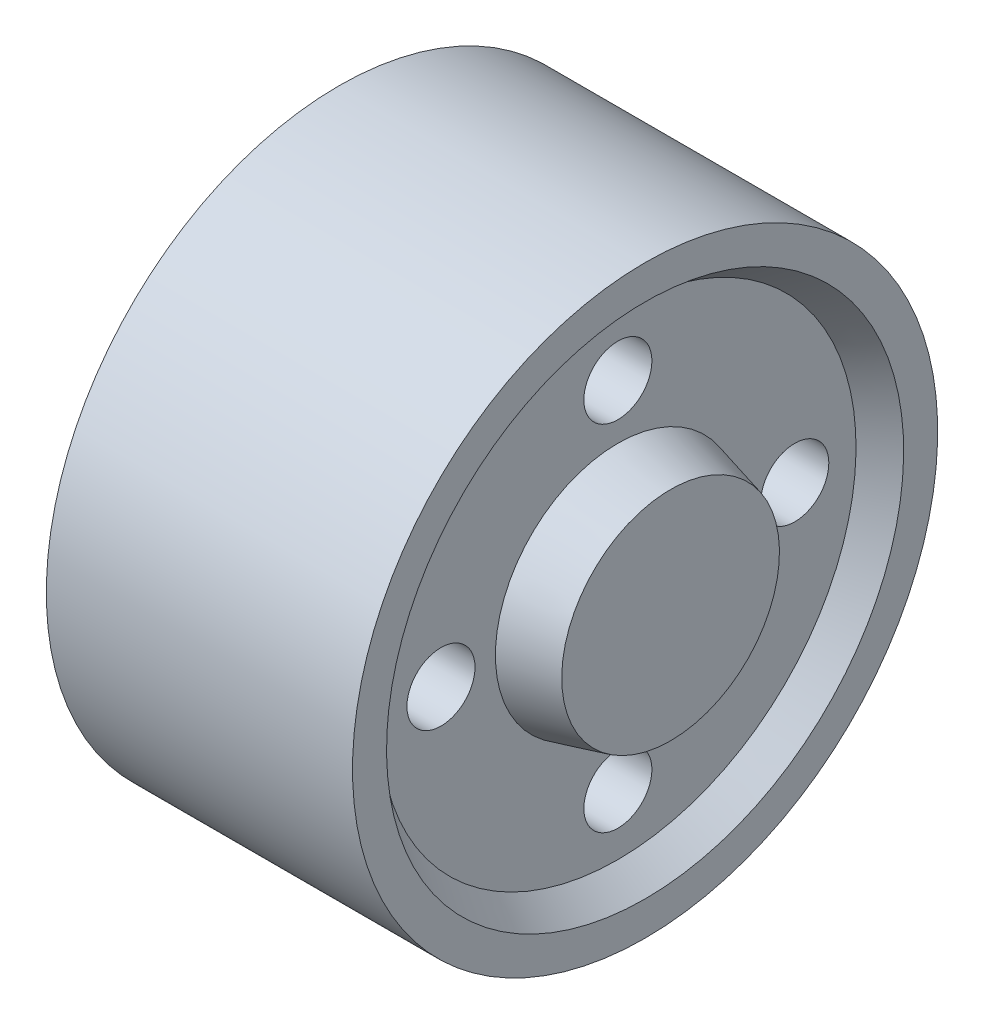
ISO-10303-21;
HEADER;
FILE_DESCRIPTION(('STEP AP214'),'2;1');
FILE_NAME('part.step','',(''),(''),'','','');
FILE_SCHEMA(('AUTOMOTIVE_DESIGN { 1 0 10303 214 1 1 1 1 }'));
ENDSEC;
DATA;
#1=APPLICATION_CONTEXT('core data for automotive mechanical design processes');
#2=APPLICATION_PROTOCOL_DEFINITION('international standard','automotive_design',2000,#1);
#3=PRODUCT_CONTEXT('',#1,'mechanical');
#4=PRODUCT('Part','Part','',(#3));
#5=PRODUCT_RELATED_PRODUCT_CATEGORY('part','',(#4));
#6=PRODUCT_DEFINITION_FORMATION('','',#4);
#7=PRODUCT_DEFINITION_CONTEXT('part definition',#1,'design');
#8=PRODUCT_DEFINITION('design','',#6,#7);
#9=PRODUCT_DEFINITION_SHAPE('','',#8);
#10=(LENGTH_UNIT() NAMED_UNIT(*) SI_UNIT(.MILLI.,.METRE.));
#11=(NAMED_UNIT(*) PLANE_ANGLE_UNIT() SI_UNIT($,.RADIAN.));
#12=(NAMED_UNIT(*) SI_UNIT($,.STERADIAN.) SOLID_ANGLE_UNIT());
#13=UNCERTAINTY_MEASURE_WITH_UNIT(LENGTH_MEASURE(1.E-05),#10,'distance_accuracy_value','');
#14=(GEOMETRIC_REPRESENTATION_CONTEXT(3) GLOBAL_UNCERTAINTY_ASSIGNED_CONTEXT((#13)) GLOBAL_UNIT_ASSIGNED_CONTEXT((#10,
#11,#12)) REPRESENTATION_CONTEXT('',''));
#15=CARTESIAN_POINT('',(0.,0.,0.));
#16=DIRECTION('',(0.,0.,1.));
#17=DIRECTION('',(1.,0.,0.));
#18=AXIS2_PLACEMENT_3D('',#15,#16,#17);
#19=CARTESIAN_POINT('',(52.4919333848297,0.,0.));
#20=DIRECTION('',(-1.,0.,0.));
#21=DIRECTION('',(0.,-1.,0.));
#22=AXIS2_PLACEMENT_3D('',#19,#20,#21);
#23=PLANE('',#22);
#24=CARTESIAN_POINT('',(52.4919333848297,0.,0.));
#25=DIRECTION('',(-1.,0.,0.));
#26=DIRECTION('',(0.,-1.,0.));
#27=AXIS2_PLACEMENT_3D('',#24,#25,#26);
#28=CIRCLE('',#27,16.);
#29=CARTESIAN_POINT('',(52.4919333848297,-16.,0.));
#30=VERTEX_POINT('',#29);
#31=EDGE_CURVE('E10',#30,#30,#28,.T.);
#32=ORIENTED_EDGE('',*,*,#31,.F.);
#33=EDGE_LOOP('',(#32));
#34=FACE_BOUND('',#33,.T.);
#35=ADVANCED_FACE('F37',(#34),#23,.F.);
#36=CARTESIAN_POINT('',(52.4919333848297,0.,0.));
#37=DIRECTION('',(-1.,0.,0.));
#38=DIRECTION('',(0.,-1.,0.));
#39=AXIS2_PLACEMENT_3D('',#36,#37,#38);
#40=CONICAL_SURFACE('',#39,16.,0.252680255142077);
#41=CARTESIAN_POINT('',(44.7459666924148,0.,0.));
#42=DIRECTION('',(-1.,0.,0.));
#43=DIRECTION('',(0.,-1.,0.));
#44=AXIS2_PLACEMENT_3D('',#41,#42,#43);
#45=CIRCLE('',#44,18.);
#46=CARTESIAN_POINT('',(44.7459666924148,-18.,0.));
#47=VERTEX_POINT('',#46);
#48=EDGE_CURVE('E44',#47,#47,#45,.T.);
#49=ORIENTED_EDGE('',*,*,#48,.F.);
#50=EDGE_LOOP('',(#49));
#51=FACE_BOUND('',#50,.T.);
#52=ORIENTED_EDGE('',*,*,#31,.T.);
#53=EDGE_LOOP('',(#52));
#54=FACE_BOUND('',#53,.T.);
#55=ADVANCED_FACE('F104',(#51,#54),#40,.T.);
#56=CARTESIAN_POINT('',(44.7459666924148,18.,0.));
#57=DIRECTION('',(-1.,0.,0.));
#58=DIRECTION('',(0.,-1.,0.));
#59=AXIS2_PLACEMENT_3D('',#56,#57,#58);
#60=PLANE('',#59);
#61=CARTESIAN_POINT('',(44.7459666924148,26.,0.));
#62=DIRECTION('',(-1.,0.,0.));
#63=DIRECTION('',(0.,-1.,0.));
#64=AXIS2_PLACEMENT_3D('',#61,#62,#63);
#65=CIRCLE('',#64,5.);
#66=CARTESIAN_POINT('',(44.7459666924148,21.,0.));
#67=VERTEX_POINT('',#66);
#68=EDGE_CURVE('E73',#67,#67,#65,.T.);
#69=ORIENTED_EDGE('',*,*,#68,.T.);
#70=EDGE_LOOP('',(#69));
#71=FACE_BOUND('',#70,.T.);
#72=CARTESIAN_POINT('',(44.7459666924148,0.,-26.));
#73=DIRECTION('',(-1.,0.,0.));
#74=DIRECTION('',(0.,-1.,0.));
#75=AXIS2_PLACEMENT_3D('',#72,#73,#74);
#76=CIRCLE('',#75,5.);
#77=CARTESIAN_POINT('',(44.7459666924148,-5.00000000000009,-26.));
#78=VERTEX_POINT('',#77);
#79=EDGE_CURVE('E62',#78,#78,#76,.T.);
#80=ORIENTED_EDGE('',*,*,#79,.T.);
#81=EDGE_LOOP('',(#80));
#82=FACE_BOUND('',#81,.T.);
#83=CARTESIAN_POINT('',(44.7459666924148,-26.,1.81557029619843E-13));
#84=DIRECTION('',(-1.,0.,0.));
#85=DIRECTION('',(0.,-1.,0.));
#86=AXIS2_PLACEMENT_3D('',#83,#84,#85);
#87=CIRCLE('',#86,5.);
#88=CARTESIAN_POINT('',(44.7459666924148,-31.,1.81557029619843E-13));
#89=VERTEX_POINT('',#88);
#90=EDGE_CURVE('E59',#89,#89,#87,.T.);
#91=ORIENTED_EDGE('',*,*,#90,.T.);
#92=EDGE_LOOP('',(#91));
#93=FACE_BOUND('',#92,.T.);
#94=CARTESIAN_POINT('',(44.7459666924148,2.77815344918226E-13,26.));
#95=DIRECTION('',(-1.,0.,0.));
#96=DIRECTION('',(0.,-1.,0.));
#97=AXIS2_PLACEMENT_3D('',#94,#95,#96);
#98=CIRCLE('',#97,5.);
#99=CARTESIAN_POINT('',(44.7459666924148,-4.99999999999972,26.));
#100=VERTEX_POINT('',#99);
#101=EDGE_CURVE('E56',#100,#100,#98,.T.);
#102=ORIENTED_EDGE('',*,*,#101,.T.);
#103=EDGE_LOOP('',(#102));
#104=FACE_BOUND('',#103,.T.);
#105=CARTESIAN_POINT('',(44.7459666924148,0.,0.));
#106=DIRECTION('',(-1.,0.,0.));
#107=DIRECTION('',(0.,-1.,0.));
#108=AXIS2_PLACEMENT_3D('',#105,#106,#107);
#109=CIRCLE('',#108,35.);
#110=CARTESIAN_POINT('',(44.7459666924148,-35.,0.));
#111=VERTEX_POINT('',#110);
#112=EDGE_CURVE('E49',#111,#111,#109,.T.);
#113=ORIENTED_EDGE('',*,*,#112,.F.);
#114=EDGE_LOOP('',(#113));
#115=FACE_BOUND('',#114,.T.);
#116=ORIENTED_EDGE('',*,*,#48,.T.);
#117=EDGE_LOOP('',(#116));
#118=FACE_BOUND('',#117,.T.);
#119=ADVANCED_FACE('F101',(#71,#82,#93,#104,#115,#118),#60,.F.);
#120=CARTESIAN_POINT('',(44.7459666924148,0.,0.));
#121=DIRECTION('',(1.,0.,0.));
#122=DIRECTION('',(0.,1.,0.));
#123=AXIS2_PLACEMENT_3D('',#120,#121,#122);
#124=CONICAL_SURFACE('',#123,35.,0.643501108793285);
#125=CARTESIAN_POINT('',(48.7459666924148,0.,0.));
#126=DIRECTION('',(-1.,0.,0.));
#127=DIRECTION('',(0.,-1.,0.));
#128=AXIS2_PLACEMENT_3D('',#125,#126,#127);
#129=CIRCLE('',#128,38.);
#130=CARTESIAN_POINT('',(48.7459666924148,-38.,0.));
#131=VERTEX_POINT('',#130);
#132=EDGE_CURVE('E94',#131,#131,#129,.T.);
#133=ORIENTED_EDGE('',*,*,#132,.F.);
#134=EDGE_LOOP('',(#133));
#135=FACE_BOUND('',#134,.T.);
#136=ORIENTED_EDGE('',*,*,#112,.T.);
#137=EDGE_LOOP('',(#136));
#138=FACE_BOUND('',#137,.T.);
#139=ADVANCED_FACE('F99',(#135,#138),#124,.F.);
#140=CARTESIAN_POINT('',(48.7459666924148,38.,0.));
#141=DIRECTION('',(-1.,0.,0.));
#142=DIRECTION('',(0.,-1.,0.));
#143=AXIS2_PLACEMENT_3D('',#140,#141,#142);
#144=PLANE('',#143);
#145=CARTESIAN_POINT('',(48.7459666924148,0.,0.));
#146=DIRECTION('',(-1.,0.,0.));
#147=DIRECTION('',(0.,-1.,0.));
#148=AXIS2_PLACEMENT_3D('',#145,#146,#147);
#149=CIRCLE('',#148,43.);
#150=CARTESIAN_POINT('',(48.7459666924148,-43.,0.));
#151=VERTEX_POINT('',#150);
#152=EDGE_CURVE('E91',#151,#151,#149,.T.);
#153=ORIENTED_EDGE('',*,*,#152,.F.);
#154=EDGE_LOOP('',(#153));
#155=FACE_BOUND('',#154,.T.);
#156=ORIENTED_EDGE('',*,*,#132,.T.);
#157=EDGE_LOOP('',(#156));
#158=FACE_BOUND('',#157,.T.);
#159=ADVANCED_FACE('F117',(#155,#158),#144,.F.);
#160=CARTESIAN_POINT('',(0.,0.,0.));
#161=DIRECTION('',(-1.,0.,0.));
#162=DIRECTION('',(0.,-1.,0.));
#163=AXIS2_PLACEMENT_3D('',#160,#161,#162);
#164=CYLINDRICAL_SURFACE('',#163,43.);
#165=CARTESIAN_POINT('',(3.74596669241484,0.,0.));
#166=DIRECTION('',(-1.,0.,0.));
#167=DIRECTION('',(0.,-1.,0.));
#168=AXIS2_PLACEMENT_3D('',#165,#166,#167);
#169=CIRCLE('',#168,43.);
#170=CARTESIAN_POINT('',(3.74596669241484,-43.,0.));
#171=VERTEX_POINT('',#170);
#172=EDGE_CURVE('E88',#171,#171,#169,.T.);
#173=ORIENTED_EDGE('',*,*,#172,.F.);
#174=EDGE_LOOP('',(#173));
#175=FACE_BOUND('',#174,.T.);
#176=ORIENTED_EDGE('',*,*,#152,.T.);
#177=EDGE_LOOP('',(#176));
#178=FACE_BOUND('',#177,.T.);
#179=ADVANCED_FACE('F121',(#175,#178),#164,.T.);
#180=CARTESIAN_POINT('',(3.74596669241483,38.,0.));
#181=DIRECTION('',(1.,0.,0.));
#182=DIRECTION('',(0.,1.,0.));
#183=AXIS2_PLACEMENT_3D('',#180,#181,#182);
#184=PLANE('',#183);
#185=CARTESIAN_POINT('',(3.74596669241484,0.,0.));
#186=DIRECTION('',(-1.,0.,0.));
#187=DIRECTION('',(0.,-1.,0.));
#188=AXIS2_PLACEMENT_3D('',#185,#186,#187);
#189=CIRCLE('',#188,38.);
#190=CARTESIAN_POINT('',(3.74596669241484,-38.,0.));
#191=VERTEX_POINT('',#190);
#192=EDGE_CURVE('E85',#191,#191,#189,.T.);
#193=ORIENTED_EDGE('',*,*,#192,.F.);
#194=EDGE_LOOP('',(#193));
#195=FACE_BOUND('',#194,.T.);
#196=ORIENTED_EDGE('',*,*,#172,.T.);
#197=EDGE_LOOP('',(#196));
#198=FACE_BOUND('',#197,.T.);
#199=ADVANCED_FACE('F125',(#195,#198),#184,.F.);
#200=CARTESIAN_POINT('',(3.74596669241484,0.,0.));
#201=DIRECTION('',(-1.,0.,0.));
#202=DIRECTION('',(0.,-1.,0.));
#203=AXIS2_PLACEMENT_3D('',#200,#201,#202);
#204=CONICAL_SURFACE('',#203,38.,0.643501108793283);
#205=CARTESIAN_POINT('',(7.74596669241484,0.,0.));
#206=DIRECTION('',(-1.,0.,0.));
#207=DIRECTION('',(0.,-1.,0.));
#208=AXIS2_PLACEMENT_3D('',#205,#206,#207);
#209=CIRCLE('',#208,35.);
#210=CARTESIAN_POINT('',(7.74596669241484,-35.,0.));
#211=VERTEX_POINT('',#210);
#212=EDGE_CURVE('E82',#211,#211,#209,.T.);
#213=ORIENTED_EDGE('',*,*,#212,.F.);
#214=EDGE_LOOP('',(#213));
#215=FACE_BOUND('',#214,.T.);
#216=ORIENTED_EDGE('',*,*,#192,.T.);
#217=EDGE_LOOP('',(#216));
#218=FACE_BOUND('',#217,.T.);
#219=ADVANCED_FACE('F129',(#215,#218),#204,.F.);
#220=CARTESIAN_POINT('',(7.74596669241484,18.,0.));
#221=DIRECTION('',(1.,0.,0.));
#222=DIRECTION('',(0.,1.,0.));
#223=AXIS2_PLACEMENT_3D('',#220,#221,#222);
#224=PLANE('',#223);
#225=CARTESIAN_POINT('',(7.74596669241483,26.,0.));
#226=DIRECTION('',(1.,0.,0.));
#227=DIRECTION('',(0.,1.,0.));
#228=AXIS2_PLACEMENT_3D('',#225,#226,#227);
#229=CIRCLE('',#228,5.);
#230=CARTESIAN_POINT('',(7.74596669241483,31.,0.));
#231=VERTEX_POINT('',#230);
#232=EDGE_CURVE('E40',#231,#231,#229,.T.);
#233=ORIENTED_EDGE('',*,*,#232,.T.);
#234=EDGE_LOOP('',(#233));
#235=FACE_BOUND('',#234,.T.);
#236=CARTESIAN_POINT('',(7.74596669241484,0.,-26.));
#237=DIRECTION('',(1.,0.,0.));
#238=DIRECTION('',(0.,1.,0.));
#239=AXIS2_PLACEMENT_3D('',#236,#237,#238);
#240=CIRCLE('',#239,5.);
#241=CARTESIAN_POINT('',(7.74596669241484,4.99999999999991,-26.));
#242=VERTEX_POINT('',#241);
#243=EDGE_CURVE('E60',#242,#242,#240,.T.);
#244=ORIENTED_EDGE('',*,*,#243,.T.);
#245=EDGE_LOOP('',(#244));
#246=FACE_BOUND('',#245,.T.);
#247=CARTESIAN_POINT('',(7.74596669241484,-26.,1.81557029619843E-13));
#248=DIRECTION('',(1.,0.,0.));
#249=DIRECTION('',(0.,1.,0.));
#250=AXIS2_PLACEMENT_3D('',#247,#248,#249);
#251=CIRCLE('',#250,5.);
#252=CARTESIAN_POINT('',(7.74596669241484,-21.,1.81557029619843E-13));
#253=VERTEX_POINT('',#252);
#254=EDGE_CURVE('E57',#253,#253,#251,.T.);
#255=ORIENTED_EDGE('',*,*,#254,.T.);
#256=EDGE_LOOP('',(#255));
#257=FACE_BOUND('',#256,.T.);
#258=CARTESIAN_POINT('',(7.74596669241484,2.73284151761381E-13,26.));
#259=DIRECTION('',(1.,0.,0.));
#260=DIRECTION('',(0.,1.,0.));
#261=AXIS2_PLACEMENT_3D('',#258,#259,#260);
#262=CIRCLE('',#261,5.);
#263=CARTESIAN_POINT('',(7.74596669241484,5.00000000000028,26.));
#264=VERTEX_POINT('',#263);
#265=EDGE_CURVE('E53',#264,#264,#262,.T.);
#266=ORIENTED_EDGE('',*,*,#265,.T.);
#267=EDGE_LOOP('',(#266));
#268=FACE_BOUND('',#267,.T.);
#269=CARTESIAN_POINT('',(7.74596669241484,0.,0.));
#270=DIRECTION('',(-1.,0.,0.));
#271=DIRECTION('',(0.,-1.,0.));
#272=AXIS2_PLACEMENT_3D('',#269,#270,#271);
#273=CIRCLE('',#272,18.);
#274=CARTESIAN_POINT('',(7.74596669241484,-18.,0.));
#275=VERTEX_POINT('',#274);
#276=EDGE_CURVE('E79',#275,#275,#273,.T.);
#277=ORIENTED_EDGE('',*,*,#276,.F.);
#278=EDGE_LOOP('',(#277));
#279=FACE_BOUND('',#278,.T.);
#280=ORIENTED_EDGE('',*,*,#212,.T.);
#281=EDGE_LOOP('',(#280));
#282=FACE_BOUND('',#281,.T.);
#283=ADVANCED_FACE('F133',(#235,#246,#257,#268,#279,#282),#224,.F.);
#284=CARTESIAN_POINT('',(7.74596669241484,0.,0.));
#285=DIRECTION('',(1.,0.,0.));
#286=DIRECTION('',(0.,1.,0.));
#287=AXIS2_PLACEMENT_3D('',#284,#285,#286);
#288=CONICAL_SURFACE('',#287,18.,0.252680255142078);
#289=CARTESIAN_POINT('',(0.,0.,0.));
#290=DIRECTION('',(-1.,0.,0.));
#291=DIRECTION('',(0.,-1.,0.));
#292=AXIS2_PLACEMENT_3D('',#289,#290,#291);
#293=CIRCLE('',#292,16.);
#294=CARTESIAN_POINT('',(0.,-16.,0.));
#295=VERTEX_POINT('',#294);
#296=EDGE_CURVE('E76',#295,#295,#293,.T.);
#297=ORIENTED_EDGE('',*,*,#296,.F.);
#298=EDGE_LOOP('',(#297));
#299=FACE_BOUND('',#298,.T.);
#300=ORIENTED_EDGE('',*,*,#276,.T.);
#301=EDGE_LOOP('',(#300));
#302=FACE_BOUND('',#301,.T.);
#303=ADVANCED_FACE('F137',(#299,#302),#288,.T.);
#304=CARTESIAN_POINT('',(0.,0.,0.));
#305=DIRECTION('',(1.,0.,0.));
#306=DIRECTION('',(0.,1.,0.));
#307=AXIS2_PLACEMENT_3D('',#304,#305,#306);
#308=PLANE('',#307);
#309=ORIENTED_EDGE('',*,*,#296,.T.);
#310=EDGE_LOOP('',(#309));
#311=FACE_BOUND('',#310,.T.);
#312=ADVANCED_FACE('F141',(#311),#308,.F.);
#313=CARTESIAN_POINT('',(2.49193338482967,2.72640718254106E-13,26.));
#314=DIRECTION('',(1.,0.,0.));
#315=DIRECTION('',(0.,1.,0.));
#316=AXIS2_PLACEMENT_3D('',#313,#314,#315);
#317=CYLINDRICAL_SURFACE('',#316,5.);
#318=ORIENTED_EDGE('',*,*,#265,.F.);
#319=EDGE_LOOP('',(#318));
#320=FACE_BOUND('',#319,.T.);
#321=ORIENTED_EDGE('',*,*,#101,.F.);
#322=EDGE_LOOP('',(#321));
#323=FACE_BOUND('',#322,.T.);
#324=ADVANCED_FACE('F145',(#320,#323),#317,.F.);
#325=CARTESIAN_POINT('',(2.49193338482967,-26.,1.81557029619843E-13));
#326=DIRECTION('',(1.,0.,0.));
#327=DIRECTION('',(0.,1.,0.));
#328=AXIS2_PLACEMENT_3D('',#325,#326,#327);
#329=CYLINDRICAL_SURFACE('',#328,5.);
#330=ORIENTED_EDGE('',*,*,#254,.F.);
#331=EDGE_LOOP('',(#330));
#332=FACE_BOUND('',#331,.T.);
#333=ORIENTED_EDGE('',*,*,#90,.F.);
#334=EDGE_LOOP('',(#333));
#335=FACE_BOUND('',#334,.T.);
#336=ADVANCED_FACE('F149',(#332,#335),#329,.F.);
#337=CARTESIAN_POINT('',(2.49193338482967,0.,-26.));
#338=DIRECTION('',(1.,0.,0.));
#339=DIRECTION('',(0.,1.,0.));
#340=AXIS2_PLACEMENT_3D('',#337,#338,#339);
#341=CYLINDRICAL_SURFACE('',#340,5.);
#342=ORIENTED_EDGE('',*,*,#243,.F.);
#343=EDGE_LOOP('',(#342));
#344=FACE_BOUND('',#343,.T.);
#345=ORIENTED_EDGE('',*,*,#79,.F.);
#346=EDGE_LOOP('',(#345));
#347=FACE_BOUND('',#346,.T.);
#348=ADVANCED_FACE('F153',(#344,#347),#341,.F.);
#349=CARTESIAN_POINT('',(2.49193338482967,26.,0.));
#350=DIRECTION('',(1.,0.,0.));
#351=DIRECTION('',(0.,1.,0.));
#352=AXIS2_PLACEMENT_3D('',#349,#350,#351);
#353=CYLINDRICAL_SURFACE('',#352,5.);
#354=ORIENTED_EDGE('',*,*,#232,.F.);
#355=EDGE_LOOP('',(#354));
#356=FACE_BOUND('',#355,.T.);
#357=ORIENTED_EDGE('',*,*,#68,.F.);
#358=EDGE_LOOP('',(#357));
#359=FACE_BOUND('',#358,.T.);
#360=ADVANCED_FACE('F157',(#356,#359),#353,.F.);
#361=CLOSED_SHELL('',(#35,#55,#119,#139,#159,#179,#199,#219,#283,#303,#312,#324,#336,#348,#360));
#362=MANIFOLD_SOLID_BREP('B2',#361);
#363=ADVANCED_BREP_SHAPE_REPRESENTATION('',(#18,#362),#14);
#364=SHAPE_DEFINITION_REPRESENTATION(#9,#363);
ENDSEC;
END-ISO-10303-21;
